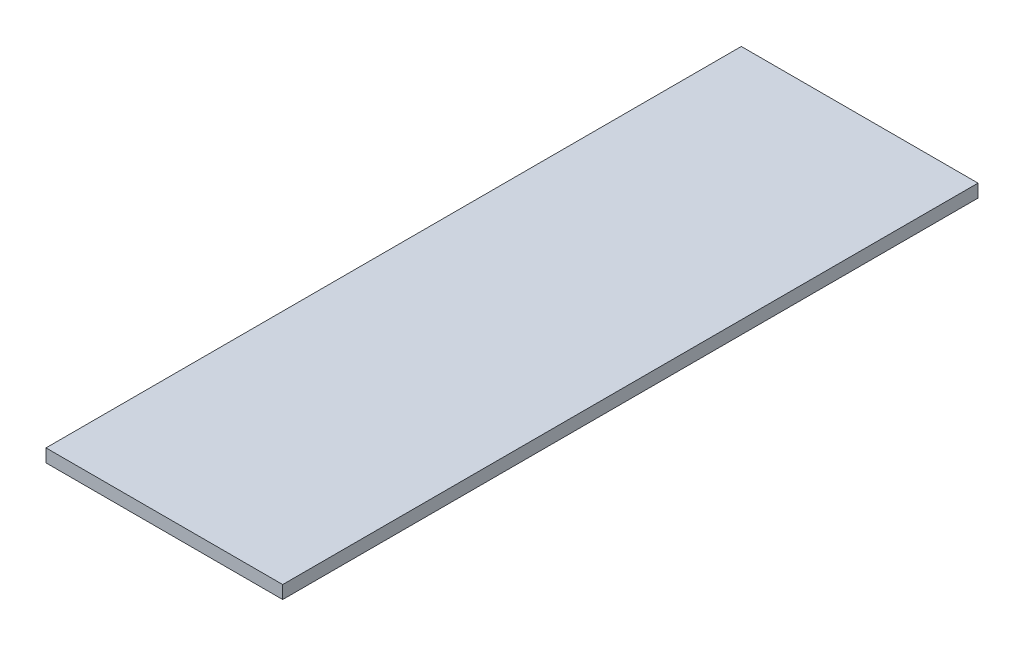
ISO-10303-21;
HEADER;
FILE_DESCRIPTION(('STEP AP214'),'2;1');
FILE_NAME('part.step','',(''),(''),'','','');
FILE_SCHEMA(('AUTOMOTIVE_DESIGN { 1 0 10303 214 1 1 1 1 }'));
ENDSEC;
DATA;
#1=APPLICATION_CONTEXT('core data for automotive mechanical design processes');
#2=APPLICATION_PROTOCOL_DEFINITION('international standard','automotive_design',2000,#1);
#3=PRODUCT_CONTEXT('',#1,'mechanical');
#4=PRODUCT('Part','Part','',(#3));
#5=PRODUCT_RELATED_PRODUCT_CATEGORY('part','',(#4));
#6=PRODUCT_DEFINITION_FORMATION('','',#4);
#7=PRODUCT_DEFINITION_CONTEXT('part definition',#1,'design');
#8=PRODUCT_DEFINITION('design','',#6,#7);
#9=PRODUCT_DEFINITION_SHAPE('','',#8);
#10=(LENGTH_UNIT() NAMED_UNIT(*) SI_UNIT(.MILLI.,.METRE.));
#11=(NAMED_UNIT(*) PLANE_ANGLE_UNIT() SI_UNIT($,.RADIAN.));
#12=(NAMED_UNIT(*) SI_UNIT($,.STERADIAN.) SOLID_ANGLE_UNIT());
#13=UNCERTAINTY_MEASURE_WITH_UNIT(LENGTH_MEASURE(1.E-05),#10,'distance_accuracy_value','');
#14=(GEOMETRIC_REPRESENTATION_CONTEXT(3) GLOBAL_UNCERTAINTY_ASSIGNED_CONTEXT((#13)) GLOBAL_UNIT_ASSIGNED_CONTEXT((#10,
#11,#12)) REPRESENTATION_CONTEXT('',''));
#15=CARTESIAN_POINT('',(0.,0.,0.));
#16=DIRECTION('',(0.,0.,1.));
#17=DIRECTION('',(1.,0.,0.));
#18=AXIS2_PLACEMENT_3D('',#15,#16,#17);
#19=CARTESIAN_POINT('',(0.,1.6,0.));
#20=DIRECTION('',(1.,0.,0.));
#21=DIRECTION('',(0.,0.,-1.));
#22=AXIS2_PLACEMENT_3D('',#19,#20,#21);
#23=PLANE('',#22);
#24=DIRECTION('',(0.,0.,1.));
#25=VECTOR('',#24,1.);
#26=CARTESIAN_POINT('',(0.,0.,0.));
#27=LINE('',#26,#25);
#28=CARTESIAN_POINT('',(0.,0.,0.));
#29=VERTEX_POINT('',#28);
#30=CARTESIAN_POINT('',(0.,0.,85.48));
#31=VERTEX_POINT('',#30);
#32=EDGE_CURVE('E117',#29,#31,#27,.T.);
#33=ORIENTED_EDGE('',*,*,#32,.T.);
#34=DIRECTION('',(0.,-1.,0.));
#35=VECTOR('',#34,1.);
#36=CARTESIAN_POINT('',(0.,1.6,85.48));
#37=LINE('',#36,#35);
#38=CARTESIAN_POINT('',(0.,1.6,85.48));
#39=VERTEX_POINT('',#38);
#40=EDGE_CURVE('E11',#39,#31,#37,.T.);
#41=ORIENTED_EDGE('',*,*,#40,.F.);
#42=DIRECTION('',(0.,0.,1.));
#43=VECTOR('',#42,1.);
#44=CARTESIAN_POINT('',(0.,1.6,0.));
#45=LINE('',#44,#43);
#46=CARTESIAN_POINT('',(0.,1.6,0.));
#47=VERTEX_POINT('',#46);
#48=EDGE_CURVE('E101',#47,#39,#45,.T.);
#49=ORIENTED_EDGE('',*,*,#48,.F.);
#50=DIRECTION('',(0.,-1.,0.));
#51=VECTOR('',#50,1.);
#52=CARTESIAN_POINT('',(0.,1.6,0.));
#53=LINE('',#52,#51);
#54=EDGE_CURVE('E113',#47,#29,#53,.T.);
#55=ORIENTED_EDGE('',*,*,#54,.T.);
#56=EDGE_LOOP('',(#33,#41,#49,#55));
#57=FACE_BOUND('',#56,.T.);
#58=ADVANCED_FACE('F49',(#57),#23,.F.);
#59=CARTESIAN_POINT('',(0.,1.6,85.48));
#60=DIRECTION('',(0.,0.,-1.));
#61=DIRECTION('',(-1.,0.,0.));
#62=AXIS2_PLACEMENT_3D('',#59,#60,#61);
#63=PLANE('',#62);
#64=DIRECTION('',(1.,0.,0.));
#65=VECTOR('',#64,1.);
#66=CARTESIAN_POINT('',(0.,0.,85.48));
#67=LINE('',#66,#65);
#68=CARTESIAN_POINT('',(29.1,0.,85.48));
#69=VERTEX_POINT('',#68);
#70=EDGE_CURVE('E106',#31,#69,#67,.T.);
#71=ORIENTED_EDGE('',*,*,#70,.T.);
#72=DIRECTION('',(0.,-1.,0.));
#73=VECTOR('',#72,1.);
#74=CARTESIAN_POINT('',(29.1,1.6,85.48));
#75=LINE('',#74,#73);
#76=CARTESIAN_POINT('',(29.1,1.6,85.48));
#77=VERTEX_POINT('',#76);
#78=EDGE_CURVE('E58',#77,#69,#75,.T.);
#79=ORIENTED_EDGE('',*,*,#78,.F.);
#80=DIRECTION('',(1.,0.,0.));
#81=VECTOR('',#80,1.);
#82=CARTESIAN_POINT('',(0.,1.6,85.48));
#83=LINE('',#82,#81);
#84=EDGE_CURVE('E96',#39,#77,#83,.T.);
#85=ORIENTED_EDGE('',*,*,#84,.F.);
#86=ORIENTED_EDGE('',*,*,#40,.T.);
#87=EDGE_LOOP('',(#71,#79,#85,#86));
#88=FACE_BOUND('',#87,.T.);
#89=ADVANCED_FACE('F105',(#88),#63,.F.);
#90=CARTESIAN_POINT('',(29.1,1.6,0.));
#91=DIRECTION('',(-1.,0.,0.));
#92=DIRECTION('',(0.,0.,1.));
#93=AXIS2_PLACEMENT_3D('',#90,#91,#92);
#94=PLANE('',#93);
#95=DIRECTION('',(0.,0.,-1.));
#96=VECTOR('',#95,1.);
#97=CARTESIAN_POINT('',(29.1,0.,0.));
#98=LINE('',#97,#96);
#99=CARTESIAN_POINT('',(29.1,0.,0.));
#100=VERTEX_POINT('',#99);
#101=EDGE_CURVE('E83',#69,#100,#98,.T.);
#102=ORIENTED_EDGE('',*,*,#101,.T.);
#103=DIRECTION('',(0.,-1.,0.));
#104=VECTOR('',#103,1.);
#105=CARTESIAN_POINT('',(29.1,1.6,0.));
#106=LINE('',#105,#104);
#107=CARTESIAN_POINT('',(29.1,1.6,0.));
#108=VERTEX_POINT('',#107);
#109=EDGE_CURVE('E108',#108,#100,#106,.T.);
#110=ORIENTED_EDGE('',*,*,#109,.F.);
#111=DIRECTION('',(0.,0.,-1.));
#112=VECTOR('',#111,1.);
#113=CARTESIAN_POINT('',(29.1,1.6,0.));
#114=LINE('',#113,#112);
#115=EDGE_CURVE('E99',#77,#108,#114,.T.);
#116=ORIENTED_EDGE('',*,*,#115,.F.);
#117=ORIENTED_EDGE('',*,*,#78,.T.);
#118=EDGE_LOOP('',(#102,#110,#116,#117));
#119=FACE_BOUND('',#118,.T.);
#120=ADVANCED_FACE('F109',(#119),#94,.F.);
#121=CARTESIAN_POINT('',(0.,1.6,0.));
#122=DIRECTION('',(0.,0.,1.));
#123=DIRECTION('',(1.,0.,0.));
#124=AXIS2_PLACEMENT_3D('',#121,#122,#123);
#125=PLANE('',#124);
#126=DIRECTION('',(-1.,0.,0.));
#127=VECTOR('',#126,1.);
#128=CARTESIAN_POINT('',(0.,0.,0.));
#129=LINE('',#128,#127);
#130=EDGE_CURVE('E89',#100,#29,#129,.T.);
#131=ORIENTED_EDGE('',*,*,#130,.T.);
#132=ORIENTED_EDGE('',*,*,#54,.F.);
#133=DIRECTION('',(-1.,0.,0.));
#134=VECTOR('',#133,1.);
#135=CARTESIAN_POINT('',(0.,1.6,0.));
#136=LINE('',#135,#134);
#137=EDGE_CURVE('E66',#108,#47,#136,.T.);
#138=ORIENTED_EDGE('',*,*,#137,.F.);
#139=ORIENTED_EDGE('',*,*,#109,.T.);
#140=EDGE_LOOP('',(#131,#132,#138,#139));
#141=FACE_BOUND('',#140,.T.);
#142=ADVANCED_FACE('F130',(#141),#125,.F.);
#143=CARTESIAN_POINT('',(0.,1.6,0.));
#144=DIRECTION('',(0.,1.,0.));
#145=DIRECTION('',(0.,0.,1.));
#146=AXIS2_PLACEMENT_3D('',#143,#144,#145);
#147=PLANE('',#146);
#148=ORIENTED_EDGE('',*,*,#48,.T.);
#149=ORIENTED_EDGE('',*,*,#84,.T.);
#150=ORIENTED_EDGE('',*,*,#115,.T.);
#151=ORIENTED_EDGE('',*,*,#137,.T.);
#152=EDGE_LOOP('',(#148,#149,#150,#151));
#153=FACE_BOUND('',#152,.T.);
#154=ADVANCED_FACE('F97',(#153),#147,.T.);
#155=CARTESIAN_POINT('',(0.,0.,0.));
#156=DIRECTION('',(0.,1.,0.));
#157=DIRECTION('',(0.,0.,1.));
#158=AXIS2_PLACEMENT_3D('',#155,#156,#157);
#159=PLANE('',#158);
#160=ORIENTED_EDGE('',*,*,#32,.F.);
#161=ORIENTED_EDGE('',*,*,#130,.F.);
#162=ORIENTED_EDGE('',*,*,#101,.F.);
#163=ORIENTED_EDGE('',*,*,#70,.F.);
#164=EDGE_LOOP('',(#160,#161,#162,#163));
#165=FACE_BOUND('',#164,.T.);
#166=ADVANCED_FACE('F133',(#165),#159,.F.);
#167=CLOSED_SHELL('',(#58,#89,#120,#142,#154,#166));
#168=MANIFOLD_SOLID_BREP('B2',#167);
#169=ADVANCED_BREP_SHAPE_REPRESENTATION('',(#18,#168),#14);
#170=SHAPE_DEFINITION_REPRESENTATION(#9,#169);
ENDSEC;
END-ISO-10303-21;
